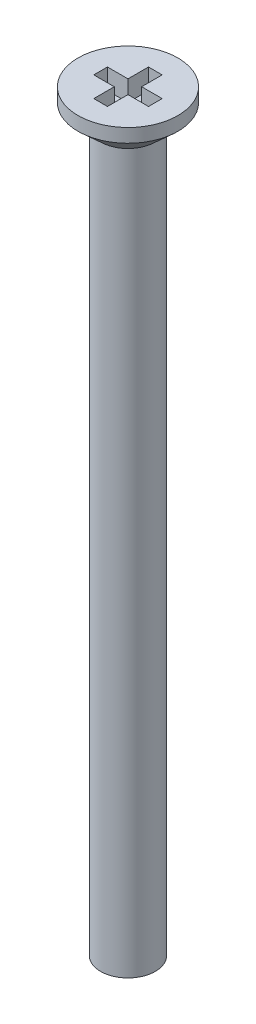
ISO-10303-21;
HEADER;
FILE_DESCRIPTION(('STEP AP214'),'2;1');
FILE_NAME('part.step','',(''),(''),'','','');
FILE_SCHEMA(('AUTOMOTIVE_DESIGN { 1 0 10303 214 1 1 1 1 }'));
ENDSEC;
DATA;
#1=APPLICATION_CONTEXT('core data for automotive mechanical design processes');
#2=APPLICATION_PROTOCOL_DEFINITION('international standard','automotive_design',2000,#1);
#3=PRODUCT_CONTEXT('',#1,'mechanical');
#4=PRODUCT('Part','Part','',(#3));
#5=PRODUCT_RELATED_PRODUCT_CATEGORY('part','',(#4));
#6=PRODUCT_DEFINITION_FORMATION('','',#4);
#7=PRODUCT_DEFINITION_CONTEXT('part definition',#1,'design');
#8=PRODUCT_DEFINITION('design','',#6,#7);
#9=PRODUCT_DEFINITION_SHAPE('','',#8);
#10=(LENGTH_UNIT() NAMED_UNIT(*) SI_UNIT(.MILLI.,.METRE.));
#11=(NAMED_UNIT(*) PLANE_ANGLE_UNIT() SI_UNIT($,.RADIAN.));
#12=(NAMED_UNIT(*) SI_UNIT($,.STERADIAN.) SOLID_ANGLE_UNIT());
#13=UNCERTAINTY_MEASURE_WITH_UNIT(LENGTH_MEASURE(1.E-05),#10,'distance_accuracy_value','');
#14=(GEOMETRIC_REPRESENTATION_CONTEXT(3) GLOBAL_UNCERTAINTY_ASSIGNED_CONTEXT((#13)) GLOBAL_UNIT_ASSIGNED_CONTEXT((#10,
#11,#12)) REPRESENTATION_CONTEXT('',''));
#15=CARTESIAN_POINT('',(0.,0.,0.));
#16=DIRECTION('',(0.,0.,1.));
#17=DIRECTION('',(1.,0.,0.));
#18=AXIS2_PLACEMENT_3D('',#15,#16,#17);
#19=CARTESIAN_POINT('',(2.45046547393701E-11,2.5,0.));
#20=DIRECTION('',(0.,-1.,0.));
#21=DIRECTION('',(1.,0.,0.));
#22=AXIS2_PLACEMENT_3D('',#19,#20,#21);
#23=PLANE('',#22);
#24=CARTESIAN_POINT('',(0.,2.5,0.));
#25=DIRECTION('',(0.,1.,0.));
#26=DIRECTION('',(-1.,0.,0.));
#27=AXIS2_PLACEMENT_3D('',#24,#25,#26);
#28=CIRCLE('',#27,3.6500000000245);
#29=CARTESIAN_POINT('',(-3.6500000000245,2.5,0.));
#30=VERTEX_POINT('',#29);
#31=EDGE_CURVE('E11',#30,#30,#28,.T.);
#32=ORIENTED_EDGE('',*,*,#31,.T.);
#33=EDGE_LOOP('',(#32));
#34=FACE_BOUND('',#33,.T.);
#35=DIRECTION('',(0.,0.,1.));
#36=VECTOR('',#35,1.);
#37=CARTESIAN_POINT('',(2.,2.5,0.));
#38=LINE('',#37,#36);
#39=CARTESIAN_POINT('',(2.,2.5,-0.5));
#40=VERTEX_POINT('',#39);
#41=CARTESIAN_POINT('',(2.,2.5,0.5));
#42=VERTEX_POINT('',#41);
#43=EDGE_CURVE('E47',#40,#42,#38,.T.);
#44=ORIENTED_EDGE('',*,*,#43,.T.);
#45=DIRECTION('',(1.,0.,0.));
#46=VECTOR('',#45,1.);
#47=CARTESIAN_POINT('',(0.,2.5,0.5));
#48=LINE('',#47,#46);
#49=CARTESIAN_POINT('',(0.5,2.5,0.5));
#50=VERTEX_POINT('',#49);
#51=EDGE_CURVE('E188',#50,#42,#48,.T.);
#52=ORIENTED_EDGE('',*,*,#51,.F.);
#53=DIRECTION('',(0.,0.,1.));
#54=VECTOR('',#53,1.);
#55=CARTESIAN_POINT('',(0.5,2.5,0.));
#56=LINE('',#55,#54);
#57=CARTESIAN_POINT('',(0.5,2.5,2.));
#58=VERTEX_POINT('',#57);
#59=EDGE_CURVE('E186',#50,#58,#56,.T.);
#60=ORIENTED_EDGE('',*,*,#59,.T.);
#61=DIRECTION('',(1.,0.,0.));
#62=VECTOR('',#61,1.);
#63=CARTESIAN_POINT('',(0.,2.5,2.));
#64=LINE('',#63,#62);
#65=CARTESIAN_POINT('',(-0.5,2.5,2.));
#66=VERTEX_POINT('',#65);
#67=EDGE_CURVE('E145',#66,#58,#64,.T.);
#68=ORIENTED_EDGE('',*,*,#67,.F.);
#69=DIRECTION('',(0.,0.,1.));
#70=VECTOR('',#69,1.);
#71=CARTESIAN_POINT('',(-0.5,2.5,0.));
#72=LINE('',#71,#70);
#73=CARTESIAN_POINT('',(-0.5,2.5,0.5));
#74=VERTEX_POINT('',#73);
#75=EDGE_CURVE('E182',#74,#66,#72,.T.);
#76=ORIENTED_EDGE('',*,*,#75,.F.);
#77=DIRECTION('',(1.,0.,0.));
#78=VECTOR('',#77,1.);
#79=CARTESIAN_POINT('',(0.,2.5,0.5));
#80=LINE('',#79,#78);
#81=CARTESIAN_POINT('',(-2.,2.5,0.5));
#82=VERTEX_POINT('',#81);
#83=EDGE_CURVE('E179',#82,#74,#80,.T.);
#84=ORIENTED_EDGE('',*,*,#83,.F.);
#85=DIRECTION('',(0.,0.,1.));
#86=VECTOR('',#85,1.);
#87=CARTESIAN_POINT('',(-2.,2.5,0.));
#88=LINE('',#87,#86);
#89=CARTESIAN_POINT('',(-2.,2.5,-0.5));
#90=VERTEX_POINT('',#89);
#91=EDGE_CURVE('E176',#90,#82,#88,.T.);
#92=ORIENTED_EDGE('',*,*,#91,.F.);
#93=DIRECTION('',(1.,0.,0.));
#94=VECTOR('',#93,1.);
#95=CARTESIAN_POINT('',(0.,2.5,-0.5));
#96=LINE('',#95,#94);
#97=CARTESIAN_POINT('',(-0.5,2.5,-0.5));
#98=VERTEX_POINT('',#97);
#99=EDGE_CURVE('E173',#90,#98,#96,.T.);
#100=ORIENTED_EDGE('',*,*,#99,.T.);
#101=DIRECTION('',(0.,0.,1.));
#102=VECTOR('',#101,1.);
#103=CARTESIAN_POINT('',(-0.5,2.5,0.));
#104=LINE('',#103,#102);
#105=CARTESIAN_POINT('',(-0.5,2.5,-2.));
#106=VERTEX_POINT('',#105);
#107=EDGE_CURVE('E170',#106,#98,#104,.T.);
#108=ORIENTED_EDGE('',*,*,#107,.F.);
#109=DIRECTION('',(1.,0.,0.));
#110=VECTOR('',#109,1.);
#111=CARTESIAN_POINT('',(0.,2.5,-2.));
#112=LINE('',#111,#110);
#113=CARTESIAN_POINT('',(0.5,2.5,-2.));
#114=VERTEX_POINT('',#113);
#115=EDGE_CURVE('E167',#106,#114,#112,.T.);
#116=ORIENTED_EDGE('',*,*,#115,.T.);
#117=DIRECTION('',(0.,0.,1.));
#118=VECTOR('',#117,1.);
#119=CARTESIAN_POINT('',(0.5,2.5,0.));
#120=LINE('',#119,#118);
#121=CARTESIAN_POINT('',(0.5,2.5,-0.5));
#122=VERTEX_POINT('',#121);
#123=EDGE_CURVE('E164',#114,#122,#120,.T.);
#124=ORIENTED_EDGE('',*,*,#123,.T.);
#125=DIRECTION('',(1.,0.,0.));
#126=VECTOR('',#125,1.);
#127=CARTESIAN_POINT('',(0.,2.5,-0.5));
#128=LINE('',#127,#126);
#129=EDGE_CURVE('E161',#122,#40,#128,.T.);
#130=ORIENTED_EDGE('',*,*,#129,.T.);
#131=EDGE_LOOP('',(#44,#52,#60,#68,#76,#84,#92,#100,#108,#116,#124,#130));
#132=FACE_BOUND('',#131,.T.);
#133=ADVANCED_FACE('F33',(#34,#132),#23,.F.);
#134=CARTESIAN_POINT('',(0.,27.929971314958,0.));
#135=DIRECTION('',(0.,1.,0.));
#136=DIRECTION('',(-1.,0.,0.));
#137=AXIS2_PLACEMENT_3D('',#134,#135,#136);
#138=CYLINDRICAL_SURFACE('',#137,3.6500000000245);
#139=ORIENTED_EDGE('',*,*,#31,.F.);
#140=EDGE_LOOP('',(#139));
#141=FACE_BOUND('',#140,.T.);
#142=CARTESIAN_POINT('',(0.,1.5,0.));
#143=DIRECTION('',(0.,1.,0.));
#144=DIRECTION('',(-1.,0.,0.));
#145=AXIS2_PLACEMENT_3D('',#142,#143,#144);
#146=CIRCLE('',#145,3.6500000000245);
#147=CARTESIAN_POINT('',(-3.6500000000245,1.5,0.));
#148=VERTEX_POINT('',#147);
#149=EDGE_CURVE('E40',#148,#148,#146,.T.);
#150=ORIENTED_EDGE('',*,*,#149,.T.);
#151=EDGE_LOOP('',(#150));
#152=FACE_BOUND('',#151,.T.);
#153=ADVANCED_FACE('F216',(#141,#152),#138,.T.);
#154=CARTESIAN_POINT('',(0.,0.,0.));
#155=DIRECTION('',(0.,1.,0.));
#156=DIRECTION('',(-1.,0.,0.));
#157=AXIS2_PLACEMENT_3D('',#154,#155,#156);
#158=CONICAL_SURFACE('',#157,2.00000000002449,0.832981266674434);
#159=ORIENTED_EDGE('',*,*,#149,.F.);
#160=EDGE_LOOP('',(#159));
#161=FACE_BOUND('',#160,.T.);
#162=CARTESIAN_POINT('',(0.,0.,0.));
#163=DIRECTION('',(0.,1.,0.));
#164=DIRECTION('',(-1.,0.,0.));
#165=AXIS2_PLACEMENT_3D('',#162,#163,#164);
#166=CIRCLE('',#165,2.00000000002449);
#167=CARTESIAN_POINT('',(-2.00000000002449,0.,0.));
#168=VERTEX_POINT('',#167);
#169=EDGE_CURVE('E211',#168,#168,#166,.T.);
#170=ORIENTED_EDGE('',*,*,#169,.T.);
#171=EDGE_LOOP('',(#170));
#172=FACE_BOUND('',#171,.T.);
#173=ADVANCED_FACE('F218',(#161,#172),#158,.T.);
#174=CARTESIAN_POINT('',(0.,27.929971314958,0.));
#175=DIRECTION('',(0.,1.,0.));
#176=DIRECTION('',(-1.,0.,0.));
#177=AXIS2_PLACEMENT_3D('',#174,#175,#176);
#178=CYLINDRICAL_SURFACE('',#177,2.00000000002449);
#179=ORIENTED_EDGE('',*,*,#169,.F.);
#180=EDGE_LOOP('',(#179));
#181=FACE_BOUND('',#180,.T.);
#182=CARTESIAN_POINT('',(0.,-52.5,0.));
#183=DIRECTION('',(0.,1.,0.));
#184=DIRECTION('',(-1.,0.,0.));
#185=AXIS2_PLACEMENT_3D('',#182,#183,#184);
#186=CIRCLE('',#185,2.00000000002449);
#187=CARTESIAN_POINT('',(-2.00000000002449,-52.5,0.));
#188=VERTEX_POINT('',#187);
#189=EDGE_CURVE('E191',#188,#188,#186,.T.);
#190=ORIENTED_EDGE('',*,*,#189,.T.);
#191=EDGE_LOOP('',(#190));
#192=FACE_BOUND('',#191,.T.);
#193=ADVANCED_FACE('F221',(#181,#192),#178,.T.);
#194=CARTESIAN_POINT('',(2.0000000000245,-52.5,0.));
#195=DIRECTION('',(0.,1.,0.));
#196=DIRECTION('',(-1.,0.,0.));
#197=AXIS2_PLACEMENT_3D('',#194,#195,#196);
#198=PLANE('',#197);
#199=ORIENTED_EDGE('',*,*,#189,.F.);
#200=EDGE_LOOP('',(#199));
#201=FACE_BOUND('',#200,.T.);
#202=ADVANCED_FACE('F227',(#201),#198,.F.);
#203=CARTESIAN_POINT('',(2.,1.,0.));
#204=DIRECTION('',(-1.,0.,0.));
#205=DIRECTION('',(0.,0.,1.));
#206=AXIS2_PLACEMENT_3D('',#203,#204,#205);
#207=PLANE('',#206);
#208=ORIENTED_EDGE('',*,*,#43,.F.);
#209=DIRECTION('',(0.,1.,0.));
#210=VECTOR('',#209,1.);
#211=CARTESIAN_POINT('',(2.,1.,-0.5));
#212=LINE('',#211,#210);
#213=CARTESIAN_POINT('',(2.,1.,-0.5));
#214=VERTEX_POINT('',#213);
#215=EDGE_CURVE('E159',#214,#40,#212,.T.);
#216=ORIENTED_EDGE('',*,*,#215,.F.);
#217=DIRECTION('',(0.,0.,1.));
#218=VECTOR('',#217,1.);
#219=CARTESIAN_POINT('',(2.,1.,0.));
#220=LINE('',#219,#218);
#221=CARTESIAN_POINT('',(2.,1.,0.5));
#222=VERTEX_POINT('',#221);
#223=EDGE_CURVE('E53',#214,#222,#220,.T.);
#224=ORIENTED_EDGE('',*,*,#223,.T.);
#225=DIRECTION('',(0.,1.,0.));
#226=VECTOR('',#225,1.);
#227=CARTESIAN_POINT('',(2.,1.,0.5));
#228=LINE('',#227,#226);
#229=EDGE_CURVE('E91',#222,#42,#228,.T.);
#230=ORIENTED_EDGE('',*,*,#229,.T.);
#231=EDGE_LOOP('',(#208,#216,#224,#230));
#232=FACE_BOUND('',#231,.T.);
#233=ADVANCED_FACE('F232',(#232),#207,.T.);
#234=CARTESIAN_POINT('',(0.,1.,0.5));
#235=DIRECTION('',(0.,0.,1.));
#236=DIRECTION('',(1.,0.,0.));
#237=AXIS2_PLACEMENT_3D('',#234,#235,#236);
#238=PLANE('',#237);
#239=ORIENTED_EDGE('',*,*,#51,.T.);
#240=ORIENTED_EDGE('',*,*,#229,.F.);
#241=DIRECTION('',(1.,0.,0.));
#242=VECTOR('',#241,1.);
#243=CARTESIAN_POINT('',(0.,1.,0.5));
#244=LINE('',#243,#242);
#245=CARTESIAN_POINT('',(0.5,1.,0.5));
#246=VERTEX_POINT('',#245);
#247=EDGE_CURVE('E137',#246,#222,#244,.T.);
#248=ORIENTED_EDGE('',*,*,#247,.F.);
#249=DIRECTION('',(0.,1.,0.));
#250=VECTOR('',#249,1.);
#251=CARTESIAN_POINT('',(0.5,1.,0.5));
#252=LINE('',#251,#250);
#253=EDGE_CURVE('E132',#246,#50,#252,.T.);
#254=ORIENTED_EDGE('',*,*,#253,.T.);
#255=EDGE_LOOP('',(#239,#240,#248,#254));
#256=FACE_BOUND('',#255,.T.);
#257=ADVANCED_FACE('F237',(#256),#238,.F.);
#258=CARTESIAN_POINT('',(0.5,1.,0.));
#259=DIRECTION('',(-1.,0.,0.));
#260=DIRECTION('',(0.,0.,1.));
#261=AXIS2_PLACEMENT_3D('',#258,#259,#260);
#262=PLANE('',#261);
#263=ORIENTED_EDGE('',*,*,#59,.F.);
#264=ORIENTED_EDGE('',*,*,#253,.F.);
#265=DIRECTION('',(0.,0.,1.));
#266=VECTOR('',#265,1.);
#267=CARTESIAN_POINT('',(0.5,1.,0.));
#268=LINE('',#267,#266);
#269=CARTESIAN_POINT('',(0.5,1.,2.));
#270=VERTEX_POINT('',#269);
#271=EDGE_CURVE('E126',#246,#270,#268,.T.);
#272=ORIENTED_EDGE('',*,*,#271,.T.);
#273=DIRECTION('',(0.,1.,0.));
#274=VECTOR('',#273,1.);
#275=CARTESIAN_POINT('',(0.5,1.,2.));
#276=LINE('',#275,#274);
#277=EDGE_CURVE('E130',#270,#58,#276,.T.);
#278=ORIENTED_EDGE('',*,*,#277,.T.);
#279=EDGE_LOOP('',(#263,#264,#272,#278));
#280=FACE_BOUND('',#279,.T.);
#281=ADVANCED_FACE('F129',(#280),#262,.T.);
#282=CARTESIAN_POINT('',(0.,1.,2.));
#283=DIRECTION('',(0.,0.,1.));
#284=DIRECTION('',(1.,0.,0.));
#285=AXIS2_PLACEMENT_3D('',#282,#283,#284);
#286=PLANE('',#285);
#287=ORIENTED_EDGE('',*,*,#67,.T.);
#288=ORIENTED_EDGE('',*,*,#277,.F.);
#289=DIRECTION('',(1.,0.,0.));
#290=VECTOR('',#289,1.);
#291=CARTESIAN_POINT('',(0.,1.,2.));
#292=LINE('',#291,#290);
#293=CARTESIAN_POINT('',(-0.5,1.,2.));
#294=VERTEX_POINT('',#293);
#295=EDGE_CURVE('E138',#294,#270,#292,.T.);
#296=ORIENTED_EDGE('',*,*,#295,.F.);
#297=DIRECTION('',(0.,1.,0.));
#298=VECTOR('',#297,1.);
#299=CARTESIAN_POINT('',(-0.5,1.,2.));
#300=LINE('',#299,#298);
#301=EDGE_CURVE('E147',#294,#66,#300,.T.);
#302=ORIENTED_EDGE('',*,*,#301,.T.);
#303=EDGE_LOOP('',(#287,#288,#296,#302));
#304=FACE_BOUND('',#303,.T.);
#305=ADVANCED_FACE('F142',(#304),#286,.F.);
#306=CARTESIAN_POINT('',(-0.5,1.,0.));
#307=DIRECTION('',(-1.,0.,0.));
#308=DIRECTION('',(0.,0.,1.));
#309=AXIS2_PLACEMENT_3D('',#306,#307,#308);
#310=PLANE('',#309);
#311=ORIENTED_EDGE('',*,*,#75,.T.);
#312=ORIENTED_EDGE('',*,*,#301,.F.);
#313=DIRECTION('',(0.,0.,1.));
#314=VECTOR('',#313,1.);
#315=CARTESIAN_POINT('',(-0.5,1.,0.));
#316=LINE('',#315,#314);
#317=CARTESIAN_POINT('',(-0.5,1.,0.5));
#318=VERTEX_POINT('',#317);
#319=EDGE_CURVE('E152',#318,#294,#316,.T.);
#320=ORIENTED_EDGE('',*,*,#319,.F.);
#321=DIRECTION('',(0.,1.,0.));
#322=VECTOR('',#321,1.);
#323=CARTESIAN_POINT('',(-0.5,1.,0.5));
#324=LINE('',#323,#322);
#325=EDGE_CURVE('E194',#318,#74,#324,.T.);
#326=ORIENTED_EDGE('',*,*,#325,.T.);
#327=EDGE_LOOP('',(#311,#312,#320,#326));
#328=FACE_BOUND('',#327,.T.);
#329=ADVANCED_FACE('F274',(#328),#310,.F.);
#330=CARTESIAN_POINT('',(0.,1.,0.5));
#331=DIRECTION('',(0.,0.,1.));
#332=DIRECTION('',(1.,0.,0.));
#333=AXIS2_PLACEMENT_3D('',#330,#331,#332);
#334=PLANE('',#333);
#335=ORIENTED_EDGE('',*,*,#83,.T.);
#336=ORIENTED_EDGE('',*,*,#325,.F.);
#337=DIRECTION('',(1.,0.,0.));
#338=VECTOR('',#337,1.);
#339=CARTESIAN_POINT('',(0.,1.,0.5));
#340=LINE('',#339,#338);
#341=CARTESIAN_POINT('',(-2.,1.,0.5));
#342=VERTEX_POINT('',#341);
#343=EDGE_CURVE('E154',#342,#318,#340,.T.);
#344=ORIENTED_EDGE('',*,*,#343,.F.);
#345=DIRECTION('',(0.,1.,0.));
#346=VECTOR('',#345,1.);
#347=CARTESIAN_POINT('',(-2.,1.,0.5));
#348=LINE('',#347,#346);
#349=EDGE_CURVE('E196',#342,#82,#348,.T.);
#350=ORIENTED_EDGE('',*,*,#349,.T.);
#351=EDGE_LOOP('',(#335,#336,#344,#350));
#352=FACE_BOUND('',#351,.T.);
#353=ADVANCED_FACE('F270',(#352),#334,.F.);
#354=CARTESIAN_POINT('',(-2.,1.,0.));
#355=DIRECTION('',(-1.,0.,0.));
#356=DIRECTION('',(0.,-1.,0.));
#357=AXIS2_PLACEMENT_3D('',#354,#355,#356);
#358=PLANE('',#357);
#359=ORIENTED_EDGE('',*,*,#91,.T.);
#360=ORIENTED_EDGE('',*,*,#349,.F.);
#361=DIRECTION('',(0.,0.,1.));
#362=VECTOR('',#361,1.);
#363=CARTESIAN_POINT('',(-2.,1.,0.));
#364=LINE('',#363,#362);
#365=CARTESIAN_POINT('',(-2.,1.,-0.5));
#366=VERTEX_POINT('',#365);
#367=EDGE_CURVE('E264',#366,#342,#364,.T.);
#368=ORIENTED_EDGE('',*,*,#367,.F.);
#369=DIRECTION('',(0.,1.,0.));
#370=VECTOR('',#369,1.);
#371=CARTESIAN_POINT('',(-2.,1.,-0.5));
#372=LINE('',#371,#370);
#373=EDGE_CURVE('E198',#366,#90,#372,.T.);
#374=ORIENTED_EDGE('',*,*,#373,.T.);
#375=EDGE_LOOP('',(#359,#360,#368,#374));
#376=FACE_BOUND('',#375,.T.);
#377=ADVANCED_FACE('F279',(#376),#358,.F.);
#378=CARTESIAN_POINT('',(0.,1.,-0.5));
#379=DIRECTION('',(0.,0.,1.));
#380=DIRECTION('',(1.,0.,0.));
#381=AXIS2_PLACEMENT_3D('',#378,#379,#380);
#382=PLANE('',#381);
#383=ORIENTED_EDGE('',*,*,#99,.F.);
#384=ORIENTED_EDGE('',*,*,#373,.F.);
#385=DIRECTION('',(1.,0.,0.));
#386=VECTOR('',#385,1.);
#387=CARTESIAN_POINT('',(0.,1.,-0.5));
#388=LINE('',#387,#386);
#389=CARTESIAN_POINT('',(-0.5,1.,-0.5));
#390=VERTEX_POINT('',#389);
#391=EDGE_CURVE('E262',#366,#390,#388,.T.);
#392=ORIENTED_EDGE('',*,*,#391,.T.);
#393=DIRECTION('',(0.,1.,0.));
#394=VECTOR('',#393,1.);
#395=CARTESIAN_POINT('',(-0.5,1.,-0.5));
#396=LINE('',#395,#394);
#397=EDGE_CURVE('E200',#390,#98,#396,.T.);
#398=ORIENTED_EDGE('',*,*,#397,.T.);
#399=EDGE_LOOP('',(#383,#384,#392,#398));
#400=FACE_BOUND('',#399,.T.);
#401=ADVANCED_FACE('F281',(#400),#382,.T.);
#402=CARTESIAN_POINT('',(-0.5,1.,0.));
#403=DIRECTION('',(-1.,0.,0.));
#404=DIRECTION('',(0.,0.,1.));
#405=AXIS2_PLACEMENT_3D('',#402,#403,#404);
#406=PLANE('',#405);
#407=ORIENTED_EDGE('',*,*,#107,.T.);
#408=ORIENTED_EDGE('',*,*,#397,.F.);
#409=DIRECTION('',(0.,0.,1.));
#410=VECTOR('',#409,1.);
#411=CARTESIAN_POINT('',(-0.5,1.,0.));
#412=LINE('',#411,#410);
#413=CARTESIAN_POINT('',(-0.5,1.,-2.));
#414=VERTEX_POINT('',#413);
#415=EDGE_CURVE('E259',#414,#390,#412,.T.);
#416=ORIENTED_EDGE('',*,*,#415,.F.);
#417=DIRECTION('',(0.,1.,0.));
#418=VECTOR('',#417,1.);
#419=CARTESIAN_POINT('',(-0.5,1.,-2.));
#420=LINE('',#419,#418);
#421=EDGE_CURVE('E202',#414,#106,#420,.T.);
#422=ORIENTED_EDGE('',*,*,#421,.T.);
#423=EDGE_LOOP('',(#407,#408,#416,#422));
#424=FACE_BOUND('',#423,.T.);
#425=ADVANCED_FACE('F285',(#424),#406,.F.);
#426=CARTESIAN_POINT('',(0.,1.,-2.));
#427=DIRECTION('',(0.,0.,1.));
#428=DIRECTION('',(1.,0.,0.));
#429=AXIS2_PLACEMENT_3D('',#426,#427,#428);
#430=PLANE('',#429);
#431=ORIENTED_EDGE('',*,*,#115,.F.);
#432=ORIENTED_EDGE('',*,*,#421,.F.);
#433=DIRECTION('',(1.,0.,0.));
#434=VECTOR('',#433,1.);
#435=CARTESIAN_POINT('',(0.,1.,-2.));
#436=LINE('',#435,#434);
#437=CARTESIAN_POINT('',(0.5,1.,-2.));
#438=VERTEX_POINT('',#437);
#439=EDGE_CURVE('E257',#414,#438,#436,.T.);
#440=ORIENTED_EDGE('',*,*,#439,.T.);
#441=DIRECTION('',(0.,1.,0.));
#442=VECTOR('',#441,1.);
#443=CARTESIAN_POINT('',(0.5,1.,-2.));
#444=LINE('',#443,#442);
#445=EDGE_CURVE('E204',#438,#114,#444,.T.);
#446=ORIENTED_EDGE('',*,*,#445,.T.);
#447=EDGE_LOOP('',(#431,#432,#440,#446));
#448=FACE_BOUND('',#447,.T.);
#449=ADVANCED_FACE('F288',(#448),#430,.T.);
#450=CARTESIAN_POINT('',(0.5,1.,0.));
#451=DIRECTION('',(-1.,0.,0.));
#452=DIRECTION('',(0.,0.,1.));
#453=AXIS2_PLACEMENT_3D('',#450,#451,#452);
#454=PLANE('',#453);
#455=ORIENTED_EDGE('',*,*,#123,.F.);
#456=ORIENTED_EDGE('',*,*,#445,.F.);
#457=DIRECTION('',(0.,0.,1.));
#458=VECTOR('',#457,1.);
#459=CARTESIAN_POINT('',(0.5,1.,0.));
#460=LINE('',#459,#458);
#461=CARTESIAN_POINT('',(0.5,1.,-0.5));
#462=VERTEX_POINT('',#461);
#463=EDGE_CURVE('E253',#438,#462,#460,.T.);
#464=ORIENTED_EDGE('',*,*,#463,.T.);
#465=DIRECTION('',(0.,1.,0.));
#466=VECTOR('',#465,1.);
#467=CARTESIAN_POINT('',(0.5,1.,-0.5));
#468=LINE('',#467,#466);
#469=EDGE_CURVE('E206',#462,#122,#468,.T.);
#470=ORIENTED_EDGE('',*,*,#469,.T.);
#471=EDGE_LOOP('',(#455,#456,#464,#470));
#472=FACE_BOUND('',#471,.T.);
#473=ADVANCED_FACE('F292',(#472),#454,.T.);
#474=CARTESIAN_POINT('',(0.,1.,-0.5));
#475=DIRECTION('',(0.,0.,1.));
#476=DIRECTION('',(1.,0.,0.));
#477=AXIS2_PLACEMENT_3D('',#474,#475,#476);
#478=PLANE('',#477);
#479=ORIENTED_EDGE('',*,*,#129,.F.);
#480=ORIENTED_EDGE('',*,*,#469,.F.);
#481=DIRECTION('',(1.,0.,0.));
#482=VECTOR('',#481,1.);
#483=CARTESIAN_POINT('',(0.,1.,-0.5));
#484=LINE('',#483,#482);
#485=EDGE_CURVE('E99',#462,#214,#484,.T.);
#486=ORIENTED_EDGE('',*,*,#485,.T.);
#487=ORIENTED_EDGE('',*,*,#215,.T.);
#488=EDGE_LOOP('',(#479,#480,#486,#487));
#489=FACE_BOUND('',#488,.T.);
#490=ADVANCED_FACE('F250',(#489),#478,.T.);
#491=CARTESIAN_POINT('',(0.,1.,0.));
#492=DIRECTION('',(0.,1.,0.));
#493=DIRECTION('',(-1.,0.,0.));
#494=AXIS2_PLACEMENT_3D('',#491,#492,#493);
#495=PLANE('',#494);
#496=ORIENTED_EDGE('',*,*,#223,.F.);
#497=ORIENTED_EDGE('',*,*,#485,.F.);
#498=ORIENTED_EDGE('',*,*,#463,.F.);
#499=ORIENTED_EDGE('',*,*,#439,.F.);
#500=ORIENTED_EDGE('',*,*,#415,.T.);
#501=ORIENTED_EDGE('',*,*,#391,.F.);
#502=ORIENTED_EDGE('',*,*,#367,.T.);
#503=ORIENTED_EDGE('',*,*,#343,.T.);
#504=ORIENTED_EDGE('',*,*,#319,.T.);
#505=ORIENTED_EDGE('',*,*,#295,.T.);
#506=ORIENTED_EDGE('',*,*,#271,.F.);
#507=ORIENTED_EDGE('',*,*,#247,.T.);
#508=EDGE_LOOP('',(#496,#497,#498,#499,#500,#501,#502,#503,#504,#505,#506,#507));
#509=FACE_BOUND('',#508,.T.);
#510=ADVANCED_FACE('F149',(#509),#495,.T.);
#511=CLOSED_SHELL('',(#133,#153,#173,#193,#202,#233,#257,#281,#305,#329,#353,#377,#401,#425,
#449,#473,#490,#510));
#512=MANIFOLD_SOLID_BREP('B2',#511);
#513=ADVANCED_BREP_SHAPE_REPRESENTATION('',(#18,#512),#14);
#514=SHAPE_DEFINITION_REPRESENTATION(#9,#513);
ENDSEC;
END-ISO-10303-21;
